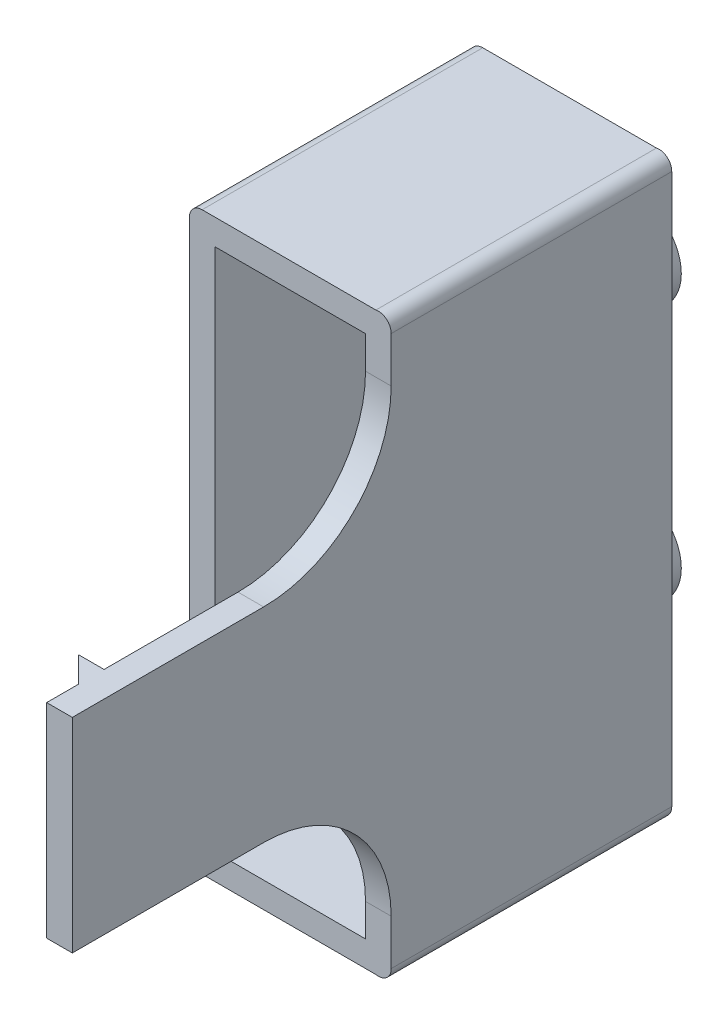
ISO-10303-21;
HEADER;
FILE_DESCRIPTION(('STEP AP214'),'2;1');
FILE_NAME('part.step','',(''),(''),'','','');
FILE_SCHEMA(('AUTOMOTIVE_DESIGN { 1 0 10303 214 1 1 1 1 }'));
ENDSEC;
DATA;
#1=APPLICATION_CONTEXT('core data for automotive mechanical design processes');
#2=APPLICATION_PROTOCOL_DEFINITION('international standard','automotive_design',2000,#1);
#3=PRODUCT_CONTEXT('',#1,'mechanical');
#4=PRODUCT('Part','Part','',(#3));
#5=PRODUCT_RELATED_PRODUCT_CATEGORY('part','',(#4));
#6=PRODUCT_DEFINITION_FORMATION('','',#4);
#7=PRODUCT_DEFINITION_CONTEXT('part definition',#1,'design');
#8=PRODUCT_DEFINITION('design','',#6,#7);
#9=PRODUCT_DEFINITION_SHAPE('','',#8);
#10=(LENGTH_UNIT() NAMED_UNIT(*) SI_UNIT(.MILLI.,.METRE.));
#11=(NAMED_UNIT(*) PLANE_ANGLE_UNIT() SI_UNIT($,.RADIAN.));
#12=(NAMED_UNIT(*) SI_UNIT($,.STERADIAN.) SOLID_ANGLE_UNIT());
#13=UNCERTAINTY_MEASURE_WITH_UNIT(LENGTH_MEASURE(1.E-05),#10,'distance_accuracy_value','');
#14=(GEOMETRIC_REPRESENTATION_CONTEXT(3) GLOBAL_UNCERTAINTY_ASSIGNED_CONTEXT((#13)) GLOBAL_UNIT_ASSIGNED_CONTEXT((#10,
#11,#12)) REPRESENTATION_CONTEXT('',''));
#15=CARTESIAN_POINT('',(0.,0.,0.));
#16=DIRECTION('',(0.,0.,1.));
#17=DIRECTION('',(1.,0.,0.));
#18=AXIS2_PLACEMENT_3D('',#15,#16,#17);
#19=CARTESIAN_POINT('',(5.9,20.55,-37.7603788570682));
#20=DIRECTION('',(1.,0.,0.));
#21=DIRECTION('',(0.,1.,0.));
#22=AXIS2_PLACEMENT_3D('',#19,#20,#21);
#23=PLANE('',#22);
#24=DIRECTION('',(0.,0.,-1.));
#25=VECTOR('',#24,1.);
#26=CARTESIAN_POINT('',(5.9,-8.00000000000002,52.));
#27=LINE('',#26,#25);
#28=CARTESIAN_POINT('',(5.9,-8.00000000000002,47.5));
#29=VERTEX_POINT('',#28);
#30=CARTESIAN_POINT('',(5.9,-8.00000000000002,37.));
#31=VERTEX_POINT('',#30);
#32=EDGE_CURVE('E56',#29,#31,#27,.T.);
#33=ORIENTED_EDGE('',*,*,#32,.F.);
#34=DIRECTION('',(0.,-1.,0.));
#35=VECTOR('',#34,1.);
#36=CARTESIAN_POINT('',(5.9,10.8284271247457,47.5));
#37=LINE('',#36,#35);
#38=CARTESIAN_POINT('',(5.9,7.99999999999998,47.5));
#39=VERTEX_POINT('',#38);
#40=EDGE_CURVE('E197',#39,#29,#37,.T.);
#41=ORIENTED_EDGE('',*,*,#40,.F.);
#42=DIRECTION('',(0.,0.,-1.));
#43=VECTOR('',#42,1.);
#44=CARTESIAN_POINT('',(5.9,7.99999999999998,52.));
#45=LINE('',#44,#43);
#46=CARTESIAN_POINT('',(5.9,7.99999999999998,37.));
#47=VERTEX_POINT('',#46);
#48=EDGE_CURVE('E231',#39,#47,#45,.T.);
#49=ORIENTED_EDGE('',*,*,#48,.T.);
#50=CARTESIAN_POINT('',(5.9,18.,37.));
#51=DIRECTION('',(1.,0.,0.));
#52=DIRECTION('',(0.,1.,0.));
#53=AXIS2_PLACEMENT_3D('',#50,#51,#52);
#54=CIRCLE('',#53,10.);
#55=CARTESIAN_POINT('',(5.9,18.,27.));
#56=VERTEX_POINT('',#55);
#57=EDGE_CURVE('E417',#47,#56,#54,.T.);
#58=ORIENTED_EDGE('',*,*,#57,.T.);
#59=DIRECTION('',(0.,1.,0.));
#60=VECTOR('',#59,1.);
#61=CARTESIAN_POINT('',(5.9,20.55,27.));
#62=LINE('',#61,#60);
#63=CARTESIAN_POINT('',(5.9,20.55,27.));
#64=VERTEX_POINT('',#63);
#65=EDGE_CURVE('E263',#56,#64,#62,.T.);
#66=ORIENTED_EDGE('',*,*,#65,.T.);
#67=DIRECTION('',(0.,0.,1.));
#68=VECTOR('',#67,1.);
#69=CARTESIAN_POINT('',(5.9,20.55,-37.7603788570682));
#70=LINE('',#69,#68);
#71=CARTESIAN_POINT('',(5.9,20.55,7.));
#72=VERTEX_POINT('',#71);
#73=EDGE_CURVE('E275',#72,#64,#70,.T.);
#74=ORIENTED_EDGE('',*,*,#73,.F.);
#75=DIRECTION('',(0.,-1.,0.));
#76=VECTOR('',#75,1.);
#77=CARTESIAN_POINT('',(5.9,20.55,7.));
#78=LINE('',#77,#76);
#79=CARTESIAN_POINT('',(5.9,-20.55,7.));
#80=VERTEX_POINT('',#79);
#81=EDGE_CURVE('E246',#72,#80,#78,.T.);
#82=ORIENTED_EDGE('',*,*,#81,.T.);
#83=DIRECTION('',(0.,0.,1.));
#84=VECTOR('',#83,1.);
#85=CARTESIAN_POINT('',(5.9,-20.55,-37.7603788570682));
#86=LINE('',#85,#84);
#87=CARTESIAN_POINT('',(5.9,-20.55,27.));
#88=VERTEX_POINT('',#87);
#89=EDGE_CURVE('E279',#80,#88,#86,.T.);
#90=ORIENTED_EDGE('',*,*,#89,.T.);
#91=CARTESIAN_POINT('',(5.9,-18.,27.));
#92=VERTEX_POINT('',#91);
#93=EDGE_CURVE('E264',#88,#92,#62,.T.);
#94=ORIENTED_EDGE('',*,*,#93,.T.);
#95=CARTESIAN_POINT('',(5.9,-18.,37.));
#96=DIRECTION('',(1.,0.,0.));
#97=DIRECTION('',(0.,1.,0.));
#98=AXIS2_PLACEMENT_3D('',#95,#96,#97);
#99=CIRCLE('',#98,10.);
#100=EDGE_CURVE('E12',#92,#31,#99,.T.);
#101=ORIENTED_EDGE('',*,*,#100,.T.);
#102=EDGE_LOOP('',(#33,#41,#49,#58,#66,#74,#82,#90,#94,#101));
#103=FACE_BOUND('',#102,.T.);
#104=ADVANCED_FACE('F41',(#103),#23,.F.);
#105=CARTESIAN_POINT('',(0.,-9.99916171678664,5.));
#106=DIRECTION('',(0.,0.,-1.));
#107=DIRECTION('',(-1.,0.,0.));
#108=AXIS2_PLACEMENT_3D('',#105,#106,#107);
#109=CYLINDRICAL_SURFACE('',#108,1.65);
#110=CARTESIAN_POINT('',(0.,-9.99916171678664,0.));
#111=DIRECTION('',(0.,0.,1.));
#112=DIRECTION('',(1.,0.,0.));
#113=AXIS2_PLACEMENT_3D('',#110,#111,#112);
#114=CIRCLE('',#113,1.65);
#115=CARTESIAN_POINT('',(1.65,-9.99916171678664,0.));
#116=VERTEX_POINT('',#115);
#117=EDGE_CURVE('E384',#116,#116,#114,.T.);
#118=ORIENTED_EDGE('',*,*,#117,.F.);
#119=EDGE_LOOP('',(#118));
#120=FACE_BOUND('',#119,.T.);
#121=CARTESIAN_POINT('',(0.,-9.99916171678664,7.));
#122=DIRECTION('',(0.,0.,1.));
#123=DIRECTION('',(1.,0.,0.));
#124=AXIS2_PLACEMENT_3D('',#121,#122,#123);
#125=CIRCLE('',#124,1.65);
#126=CARTESIAN_POINT('',(1.65,-9.99916171678664,7.));
#127=VERTEX_POINT('',#126);
#128=EDGE_CURVE('E288',#127,#127,#125,.T.);
#129=ORIENTED_EDGE('',*,*,#128,.T.);
#130=EDGE_LOOP('',(#129));
#131=FACE_BOUND('',#130,.T.);
#132=ADVANCED_FACE('F532',(#120,#131),#109,.F.);
#133=CARTESIAN_POINT('',(0.,9.99916171678664,27.));
#134=DIRECTION('',(0.,0.,-1.));
#135=DIRECTION('',(-1.,0.,0.));
#136=AXIS2_PLACEMENT_3D('',#133,#134,#135);
#137=CYLINDRICAL_SURFACE('',#136,1.65);
#138=CARTESIAN_POINT('',(0.,9.99916171678664,0.));
#139=DIRECTION('',(0.,0.,1.));
#140=DIRECTION('',(1.,0.,0.));
#141=AXIS2_PLACEMENT_3D('',#138,#139,#140);
#142=CIRCLE('',#141,1.65);
#143=CARTESIAN_POINT('',(1.65,9.99916171678664,0.));
#144=VERTEX_POINT('',#143);
#145=EDGE_CURVE('E292',#144,#144,#142,.T.);
#146=ORIENTED_EDGE('',*,*,#145,.F.);
#147=EDGE_LOOP('',(#146));
#148=FACE_BOUND('',#147,.T.);
#149=CARTESIAN_POINT('',(0.,9.99916171678664,7.));
#150=DIRECTION('',(0.,0.,1.));
#151=DIRECTION('',(1.,0.,0.));
#152=AXIS2_PLACEMENT_3D('',#149,#150,#151);
#153=CIRCLE('',#152,1.65);
#154=CARTESIAN_POINT('',(1.65,9.99916171678664,7.));
#155=VERTEX_POINT('',#154);
#156=EDGE_CURVE('E287',#155,#155,#153,.T.);
#157=ORIENTED_EDGE('',*,*,#156,.T.);
#158=EDGE_LOOP('',(#157));
#159=FACE_BOUND('',#158,.T.);
#160=ADVANCED_FACE('F512',(#148,#159),#137,.F.);
#161=CARTESIAN_POINT('',(6.91020488187485,-21.5802459465389,5.));
#162=DIRECTION('',(0.,0.,1.));
#163=DIRECTION('',(1.,0.,0.));
#164=AXIS2_PLACEMENT_3D('',#161,#162,#163);
#165=PLANE('',#164);
#166=CARTESIAN_POINT('',(6.91020488187485,-21.5802459465389,5.));
#167=DIRECTION('',(0.,0.,1.));
#168=DIRECTION('',(1.,0.,0.));
#169=AXIS2_PLACEMENT_3D('',#166,#167,#168);
#170=CIRCLE('',#169,1.);
#171=CARTESIAN_POINT('',(6.71,-22.56,5.));
#172=VERTEX_POINT('',#171);
#173=CARTESIAN_POINT('',(7.91,-21.5600043612965,5.));
#174=VERTEX_POINT('',#173);
#175=EDGE_CURVE('E300',#172,#174,#170,.T.);
#176=ORIENTED_EDGE('',*,*,#175,.F.);
#177=DIRECTION('',(1.,0.,0.));
#178=VECTOR('',#177,1.);
#179=CARTESIAN_POINT('',(-6.91000000000002,-22.56,5.));
#180=LINE('',#179,#178);
#181=CARTESIAN_POINT('',(-6.91000000000002,-22.56,5.));
#182=VERTEX_POINT('',#181);
#183=EDGE_CURVE('E306',#182,#172,#180,.T.);
#184=ORIENTED_EDGE('',*,*,#183,.F.);
#185=CARTESIAN_POINT('',(-6.91000000000002,-21.56,5.));
#186=DIRECTION('',(0.,0.,1.));
#187=DIRECTION('',(1.,0.,0.));
#188=AXIS2_PLACEMENT_3D('',#185,#186,#187);
#189=CIRCLE('',#188,0.999999999999995);
#190=CARTESIAN_POINT('',(-7.91000000000001,-21.56,5.));
#191=VERTEX_POINT('',#190);
#192=EDGE_CURVE('E348',#191,#182,#189,.T.);
#193=ORIENTED_EDGE('',*,*,#192,.F.);
#194=DIRECTION('',(0.,-1.,0.));
#195=VECTOR('',#194,1.);
#196=CARTESIAN_POINT('',(-7.91000000000001,21.56,5.));
#197=LINE('',#196,#195);
#198=CARTESIAN_POINT('',(-7.91000000000001,21.56,5.));
#199=VERTEX_POINT('',#198);
#200=EDGE_CURVE('E345',#199,#191,#197,.T.);
#201=ORIENTED_EDGE('',*,*,#200,.F.);
#202=CARTESIAN_POINT('',(-6.91000000000002,21.56,5.));
#203=DIRECTION('',(0.,0.,1.));
#204=DIRECTION('',(1.,0.,0.));
#205=AXIS2_PLACEMENT_3D('',#202,#203,#204);
#206=CIRCLE('',#205,1.);
#207=CARTESIAN_POINT('',(-6.91000000000002,22.56,5.));
#208=VERTEX_POINT('',#207);
#209=EDGE_CURVE('E342',#208,#199,#206,.T.);
#210=ORIENTED_EDGE('',*,*,#209,.F.);
#211=DIRECTION('',(-1.,0.,0.));
#212=VECTOR('',#211,1.);
#213=CARTESIAN_POINT('',(-6.91000000000002,22.56,5.));
#214=LINE('',#213,#212);
#215=CARTESIAN_POINT('',(6.70999999999999,22.56,5.));
#216=VERTEX_POINT('',#215);
#217=EDGE_CURVE('E339',#216,#208,#214,.T.);
#218=ORIENTED_EDGE('',*,*,#217,.F.);
#219=CARTESIAN_POINT('',(6.91020488187485,21.5802459465389,5.));
#220=DIRECTION('',(0.,0.,1.));
#221=DIRECTION('',(-1.,0.,0.));
#222=AXIS2_PLACEMENT_3D('',#219,#220,#221);
#223=CIRCLE('',#222,1.);
#224=CARTESIAN_POINT('',(7.91,21.5600043612965,5.));
#225=VERTEX_POINT('',#224);
#226=EDGE_CURVE('E336',#225,#216,#223,.T.);
#227=ORIENTED_EDGE('',*,*,#226,.F.);
#228=DIRECTION('',(0.,1.,0.));
#229=VECTOR('',#228,1.);
#230=CARTESIAN_POINT('',(7.91,21.5600043612965,5.));
#231=LINE('',#230,#229);
#232=EDGE_CURVE('E333',#174,#225,#231,.T.);
#233=ORIENTED_EDGE('',*,*,#232,.F.);
#234=EDGE_LOOP('',(#176,#184,#193,#201,#210,#218,#227,#233));
#235=FACE_BOUND('',#234,.T.);
#236=CARTESIAN_POINT('',(0.,-9.99916171678664,5.));
#237=DIRECTION('',(0.,0.,1.));
#238=DIRECTION('',(1.,0.,0.));
#239=AXIS2_PLACEMENT_3D('',#236,#237,#238);
#240=CIRCLE('',#239,3.66);
#241=CARTESIAN_POINT('',(3.66,-9.99916171678664,5.));
#242=VERTEX_POINT('',#241);
#243=EDGE_CURVE('E389',#242,#242,#240,.T.);
#244=ORIENTED_EDGE('',*,*,#243,.T.);
#245=EDGE_LOOP('',(#244));
#246=FACE_BOUND('',#245,.T.);
#247=CARTESIAN_POINT('',(0.,9.99916171678664,5.));
#248=DIRECTION('',(0.,0.,1.));
#249=DIRECTION('',(1.,0.,0.));
#250=AXIS2_PLACEMENT_3D('',#247,#248,#249);
#251=CIRCLE('',#250,3.66);
#252=CARTESIAN_POINT('',(3.66,9.99916171678664,5.));
#253=VERTEX_POINT('',#252);
#254=EDGE_CURVE('E393',#253,#253,#251,.F.);
#255=ORIENTED_EDGE('',*,*,#254,.F.);
#256=EDGE_LOOP('',(#255));
#257=FACE_BOUND('',#256,.T.);
#258=ADVANCED_FACE('F508',(#235,#246,#257),#165,.F.);
#259=CARTESIAN_POINT('',(0.,-9.99916171678664,0.));
#260=DIRECTION('',(0.,0.,1.));
#261=DIRECTION('',(1.,0.,0.));
#262=AXIS2_PLACEMENT_3D('',#259,#260,#261);
#263=PLANE('',#262);
#264=CARTESIAN_POINT('',(0.,-9.99916171678664,0.));
#265=DIRECTION('',(0.,0.,1.));
#266=DIRECTION('',(1.,0.,0.));
#267=AXIS2_PLACEMENT_3D('',#264,#265,#266);
#268=CIRCLE('',#267,3.66);
#269=CARTESIAN_POINT('',(3.66,-9.99916171678664,0.));
#270=VERTEX_POINT('',#269);
#271=EDGE_CURVE('E388',#270,#270,#268,.T.);
#272=ORIENTED_EDGE('',*,*,#271,.F.);
#273=EDGE_LOOP('',(#272));
#274=FACE_BOUND('',#273,.T.);
#275=ORIENTED_EDGE('',*,*,#117,.T.);
#276=EDGE_LOOP('',(#275));
#277=FACE_BOUND('',#276,.T.);
#278=ADVANCED_FACE('F511',(#274,#277),#263,.F.);
#279=CARTESIAN_POINT('',(0.,-9.99916171678664,5.));
#280=DIRECTION('',(0.,0.,-1.));
#281=DIRECTION('',(-1.,0.,0.));
#282=AXIS2_PLACEMENT_3D('',#279,#280,#281);
#283=CYLINDRICAL_SURFACE('',#282,3.66);
#284=ORIENTED_EDGE('',*,*,#243,.F.);
#285=EDGE_LOOP('',(#284));
#286=FACE_BOUND('',#285,.T.);
#287=ORIENTED_EDGE('',*,*,#271,.T.);
#288=EDGE_LOOP('',(#287));
#289=FACE_BOUND('',#288,.T.);
#290=ADVANCED_FACE('F570',(#286,#289),#283,.T.);
#291=CARTESIAN_POINT('',(6.91020488187485,-21.5802459465389,27.));
#292=DIRECTION('',(0.,0.,1.));
#293=DIRECTION('',(1.,0.,0.));
#294=AXIS2_PLACEMENT_3D('',#291,#292,#293);
#295=PLANE('',#294);
#296=ORIENTED_EDGE('',*,*,#65,.F.);
#297=DIRECTION('',(-1.,0.,0.));
#298=VECTOR('',#297,1.);
#299=CARTESIAN_POINT('',(6.91020488187485,18.,27.));
#300=LINE('',#299,#298);
#301=CARTESIAN_POINT('',(7.91,18.,27.));
#302=VERTEX_POINT('',#301);
#303=EDGE_CURVE('E410',#56,#302,#300,.F.);
#304=ORIENTED_EDGE('',*,*,#303,.T.);
#305=DIRECTION('',(0.,1.,0.));
#306=VECTOR('',#305,1.);
#307=CARTESIAN_POINT('',(7.91,21.5600043612965,27.));
#308=LINE('',#307,#306);
#309=CARTESIAN_POINT('',(7.91,21.5600043612965,27.));
#310=VERTEX_POINT('',#309);
#311=EDGE_CURVE('E305',#302,#310,#308,.T.);
#312=ORIENTED_EDGE('',*,*,#311,.T.);
#313=CARTESIAN_POINT('',(6.91020488187485,21.5802459465389,27.));
#314=DIRECTION('',(0.,0.,1.));
#315=DIRECTION('',(-1.,0.,0.));
#316=AXIS2_PLACEMENT_3D('',#313,#314,#315);
#317=CIRCLE('',#316,1.);
#318=CARTESIAN_POINT('',(6.70999999999999,22.56,27.));
#319=VERTEX_POINT('',#318);
#320=EDGE_CURVE('E311',#310,#319,#317,.T.);
#321=ORIENTED_EDGE('',*,*,#320,.T.);
#322=DIRECTION('',(-1.,0.,0.));
#323=VECTOR('',#322,1.);
#324=CARTESIAN_POINT('',(-6.91000000000002,22.56,27.));
#325=LINE('',#324,#323);
#326=CARTESIAN_POINT('',(-6.91000000000002,22.56,27.));
#327=VERTEX_POINT('',#326);
#328=EDGE_CURVE('E314',#319,#327,#325,.T.);
#329=ORIENTED_EDGE('',*,*,#328,.T.);
#330=CARTESIAN_POINT('',(-6.91000000000002,21.56,27.));
#331=DIRECTION('',(0.,0.,1.));
#332=DIRECTION('',(1.,0.,0.));
#333=AXIS2_PLACEMENT_3D('',#330,#331,#332);
#334=CIRCLE('',#333,1.);
#335=CARTESIAN_POINT('',(-7.91000000000001,21.56,27.));
#336=VERTEX_POINT('',#335);
#337=EDGE_CURVE('E317',#327,#336,#334,.T.);
#338=ORIENTED_EDGE('',*,*,#337,.T.);
#339=DIRECTION('',(0.,-1.,0.));
#340=VECTOR('',#339,1.);
#341=CARTESIAN_POINT('',(-7.91000000000001,21.56,27.));
#342=LINE('',#341,#340);
#343=CARTESIAN_POINT('',(-7.91000000000001,-21.56,27.));
#344=VERTEX_POINT('',#343);
#345=EDGE_CURVE('E320',#336,#344,#342,.T.);
#346=ORIENTED_EDGE('',*,*,#345,.T.);
#347=CARTESIAN_POINT('',(-6.91000000000002,-21.56,27.));
#348=DIRECTION('',(0.,0.,1.));
#349=DIRECTION('',(1.,0.,0.));
#350=AXIS2_PLACEMENT_3D('',#347,#348,#349);
#351=CIRCLE('',#350,0.999999999999995);
#352=CARTESIAN_POINT('',(-6.91000000000002,-22.56,27.));
#353=VERTEX_POINT('',#352);
#354=EDGE_CURVE('E323',#344,#353,#351,.T.);
#355=ORIENTED_EDGE('',*,*,#354,.T.);
#356=DIRECTION('',(1.,0.,0.));
#357=VECTOR('',#356,1.);
#358=CARTESIAN_POINT('',(-6.91000000000002,-22.56,27.));
#359=LINE('',#358,#357);
#360=CARTESIAN_POINT('',(6.71,-22.56,27.));
#361=VERTEX_POINT('',#360);
#362=EDGE_CURVE('E326',#353,#361,#359,.T.);
#363=ORIENTED_EDGE('',*,*,#362,.T.);
#364=CARTESIAN_POINT('',(6.91020488187485,-21.5802459465389,27.));
#365=DIRECTION('',(0.,0.,1.));
#366=DIRECTION('',(1.,0.,0.));
#367=AXIS2_PLACEMENT_3D('',#364,#365,#366);
#368=CIRCLE('',#367,1.);
#369=CARTESIAN_POINT('',(7.91,-21.5600043612965,27.));
#370=VERTEX_POINT('',#369);
#371=EDGE_CURVE('E301',#361,#370,#368,.T.);
#372=ORIENTED_EDGE('',*,*,#371,.T.);
#373=CARTESIAN_POINT('',(7.91,-18.,27.));
#374=VERTEX_POINT('',#373);
#375=EDGE_CURVE('E307',#370,#374,#308,.T.);
#376=ORIENTED_EDGE('',*,*,#375,.T.);
#377=DIRECTION('',(1.,0.,0.));
#378=VECTOR('',#377,1.);
#379=CARTESIAN_POINT('',(6.91020488187485,-18.,27.));
#380=LINE('',#379,#378);
#381=EDGE_CURVE('E407',#374,#92,#380,.F.);
#382=ORIENTED_EDGE('',*,*,#381,.T.);
#383=ORIENTED_EDGE('',*,*,#93,.F.);
#384=DIRECTION('',(1.,0.,0.));
#385=VECTOR('',#384,1.);
#386=CARTESIAN_POINT('',(-5.90000000000001,-20.55,27.));
#387=LINE('',#386,#385);
#388=CARTESIAN_POINT('',(-5.90000000000001,-20.55,27.));
#389=VERTEX_POINT('',#388);
#390=EDGE_CURVE('E259',#389,#88,#387,.T.);
#391=ORIENTED_EDGE('',*,*,#390,.F.);
#392=DIRECTION('',(0.,-1.,0.));
#393=VECTOR('',#392,1.);
#394=CARTESIAN_POINT('',(-5.90000000000001,20.55,27.));
#395=LINE('',#394,#393);
#396=CARTESIAN_POINT('',(-5.90000000000001,20.55,27.));
#397=VERTEX_POINT('',#396);
#398=EDGE_CURVE('E245',#397,#389,#395,.T.);
#399=ORIENTED_EDGE('',*,*,#398,.F.);
#400=DIRECTION('',(-1.,0.,0.));
#401=VECTOR('',#400,1.);
#402=CARTESIAN_POINT('',(-5.90000000000001,20.55,27.));
#403=LINE('',#402,#401);
#404=EDGE_CURVE('E268',#64,#397,#403,.T.);
#405=ORIENTED_EDGE('',*,*,#404,.F.);
#406=EDGE_LOOP('',(#296,#304,#312,#321,#329,#338,#346,#355,#363,#372,#376,#382,#383,#391,#399,#405));
#407=FACE_BOUND('',#406,.T.);
#408=ADVANCED_FACE('F432',(#407),#295,.T.);
#409=CARTESIAN_POINT('',(6.91020488187485,-21.5802459465389,27.));
#410=DIRECTION('',(0.,0.,-1.));
#411=DIRECTION('',(-1.,0.,0.));
#412=AXIS2_PLACEMENT_3D('',#409,#410,#411);
#413=CYLINDRICAL_SURFACE('',#412,1.);
#414=ORIENTED_EDGE('',*,*,#175,.T.);
#415=DIRECTION('',(0.,0.,-1.));
#416=VECTOR('',#415,1.);
#417=CARTESIAN_POINT('',(7.91,-21.5600043612965,27.));
#418=LINE('',#417,#416);
#419=EDGE_CURVE('E380',#370,#174,#418,.T.);
#420=ORIENTED_EDGE('',*,*,#419,.F.);
#421=ORIENTED_EDGE('',*,*,#371,.F.);
#422=DIRECTION('',(0.,0.,-1.));
#423=VECTOR('',#422,1.);
#424=CARTESIAN_POINT('',(6.71,-22.56,27.));
#425=LINE('',#424,#423);
#426=EDGE_CURVE('E329',#361,#172,#425,.T.);
#427=ORIENTED_EDGE('',*,*,#426,.T.);
#428=EDGE_LOOP('',(#414,#420,#421,#427));
#429=FACE_BOUND('',#428,.T.);
#430=ADVANCED_FACE('F506',(#429),#413,.T.);
#431=CARTESIAN_POINT('',(7.91,21.5600043612965,27.));
#432=DIRECTION('',(-1.,0.,0.));
#433=DIRECTION('',(0.,0.,1.));
#434=AXIS2_PLACEMENT_3D('',#431,#432,#433);
#435=PLANE('',#434);
#436=ORIENTED_EDGE('',*,*,#232,.T.);
#437=DIRECTION('',(0.,0.,-1.));
#438=VECTOR('',#437,1.);
#439=CARTESIAN_POINT('',(7.91,21.5600043612965,27.));
#440=LINE('',#439,#438);
#441=EDGE_CURVE('E376',#310,#225,#440,.T.);
#442=ORIENTED_EDGE('',*,*,#441,.F.);
#443=ORIENTED_EDGE('',*,*,#311,.F.);
#444=CARTESIAN_POINT('',(7.91,18.,37.));
#445=DIRECTION('',(-1.,0.,0.));
#446=DIRECTION('',(0.,0.,1.));
#447=AXIS2_PLACEMENT_3D('',#444,#445,#446);
#448=CIRCLE('',#447,10.);
#449=CARTESIAN_POINT('',(7.91000000000012,7.99999999999998,37.));
#450=VERTEX_POINT('',#449);
#451=EDGE_CURVE('E420',#302,#450,#448,.T.);
#452=ORIENTED_EDGE('',*,*,#451,.T.);
#453=DIRECTION('',(0.,0.,-1.));
#454=VECTOR('',#453,1.);
#455=CARTESIAN_POINT('',(7.91000000000012,7.99999999999998,52.));
#456=LINE('',#455,#454);
#457=CARTESIAN_POINT('',(7.91000000000012,7.99999999999998,52.));
#458=VERTEX_POINT('',#457);
#459=EDGE_CURVE('E235',#458,#450,#456,.T.);
#460=ORIENTED_EDGE('',*,*,#459,.F.);
#461=DIRECTION('',(0.,1.,0.));
#462=VECTOR('',#461,1.);
#463=CARTESIAN_POINT('',(7.91000000000012,7.99999999999998,52.));
#464=LINE('',#463,#462);
#465=CARTESIAN_POINT('',(7.91000000000012,-8.00000000000002,52.));
#466=VERTEX_POINT('',#465);
#467=EDGE_CURVE('E225',#466,#458,#464,.T.);
#468=ORIENTED_EDGE('',*,*,#467,.F.);
#469=DIRECTION('',(0.,0.,-1.));
#470=VECTOR('',#469,1.);
#471=CARTESIAN_POINT('',(7.91000000000012,-8.00000000000002,52.));
#472=LINE('',#471,#470);
#473=CARTESIAN_POINT('',(7.91000000000012,-8.00000000000002,37.));
#474=VERTEX_POINT('',#473);
#475=EDGE_CURVE('E239',#466,#474,#472,.T.);
#476=ORIENTED_EDGE('',*,*,#475,.T.);
#477=CARTESIAN_POINT('',(7.91,-18.,37.));
#478=DIRECTION('',(-1.,0.,0.));
#479=DIRECTION('',(0.,0.,1.));
#480=AXIS2_PLACEMENT_3D('',#477,#478,#479);
#481=CIRCLE('',#480,10.);
#482=EDGE_CURVE('E50',#474,#374,#481,.T.);
#483=ORIENTED_EDGE('',*,*,#482,.T.);
#484=ORIENTED_EDGE('',*,*,#375,.F.);
#485=ORIENTED_EDGE('',*,*,#419,.T.);
#486=EDGE_LOOP('',(#436,#442,#443,#452,#460,#468,#476,#483,#484,#485));
#487=FACE_BOUND('',#486,.T.);
#488=ADVANCED_FACE('F424',(#487),#435,.F.);
#489=CARTESIAN_POINT('',(6.91020488187485,21.5802459465389,27.));
#490=DIRECTION('',(0.,0.,-1.));
#491=DIRECTION('',(-1.,0.,0.));
#492=AXIS2_PLACEMENT_3D('',#489,#490,#491);
#493=CYLINDRICAL_SURFACE('',#492,1.);
#494=ORIENTED_EDGE('',*,*,#226,.T.);
#495=DIRECTION('',(0.,0.,-1.));
#496=VECTOR('',#495,1.);
#497=CARTESIAN_POINT('',(6.70999999999999,22.56,27.));
#498=LINE('',#497,#496);
#499=EDGE_CURVE('E372',#319,#216,#498,.T.);
#500=ORIENTED_EDGE('',*,*,#499,.F.);
#501=ORIENTED_EDGE('',*,*,#320,.F.);
#502=ORIENTED_EDGE('',*,*,#441,.T.);
#503=EDGE_LOOP('',(#494,#500,#501,#502));
#504=FACE_BOUND('',#503,.T.);
#505=ADVANCED_FACE('F478',(#504),#493,.T.);
#506=CARTESIAN_POINT('',(-6.91000000000002,22.56,27.));
#507=DIRECTION('',(0.,-1.,0.));
#508=DIRECTION('',(0.,0.,-1.));
#509=AXIS2_PLACEMENT_3D('',#506,#507,#508);
#510=PLANE('',#509);
#511=ORIENTED_EDGE('',*,*,#217,.T.);
#512=DIRECTION('',(0.,0.,-1.));
#513=VECTOR('',#512,1.);
#514=CARTESIAN_POINT('',(-6.91000000000002,22.56,27.));
#515=LINE('',#514,#513);
#516=EDGE_CURVE('E368',#327,#208,#515,.T.);
#517=ORIENTED_EDGE('',*,*,#516,.F.);
#518=ORIENTED_EDGE('',*,*,#328,.F.);
#519=ORIENTED_EDGE('',*,*,#499,.T.);
#520=EDGE_LOOP('',(#511,#517,#518,#519));
#521=FACE_BOUND('',#520,.T.);
#522=ADVANCED_FACE('F483',(#521),#510,.F.);
#523=CARTESIAN_POINT('',(-6.91000000000002,21.56,27.));
#524=DIRECTION('',(0.,0.,-1.));
#525=DIRECTION('',(-1.,0.,0.));
#526=AXIS2_PLACEMENT_3D('',#523,#524,#525);
#527=CYLINDRICAL_SURFACE('',#526,1.);
#528=ORIENTED_EDGE('',*,*,#209,.T.);
#529=DIRECTION('',(0.,0.,-1.));
#530=VECTOR('',#529,1.);
#531=CARTESIAN_POINT('',(-7.91000000000001,21.56,27.));
#532=LINE('',#531,#530);
#533=EDGE_CURVE('E364',#336,#199,#532,.T.);
#534=ORIENTED_EDGE('',*,*,#533,.F.);
#535=ORIENTED_EDGE('',*,*,#337,.F.);
#536=ORIENTED_EDGE('',*,*,#516,.T.);
#537=EDGE_LOOP('',(#528,#534,#535,#536));
#538=FACE_BOUND('',#537,.T.);
#539=ADVANCED_FACE('F489',(#538),#527,.T.);
#540=CARTESIAN_POINT('',(-7.91000000000001,21.56,27.));
#541=DIRECTION('',(1.,0.,0.));
#542=DIRECTION('',(0.,0.,-1.));
#543=AXIS2_PLACEMENT_3D('',#540,#541,#542);
#544=PLANE('',#543);
#545=ORIENTED_EDGE('',*,*,#200,.T.);
#546=DIRECTION('',(0.,0.,-1.));
#547=VECTOR('',#546,1.);
#548=CARTESIAN_POINT('',(-7.91000000000001,-21.56,27.));
#549=LINE('',#548,#547);
#550=EDGE_CURVE('E360',#344,#191,#549,.T.);
#551=ORIENTED_EDGE('',*,*,#550,.F.);
#552=ORIENTED_EDGE('',*,*,#345,.F.);
#553=ORIENTED_EDGE('',*,*,#533,.T.);
#554=EDGE_LOOP('',(#545,#551,#552,#553));
#555=FACE_BOUND('',#554,.T.);
#556=ADVANCED_FACE('F493',(#555),#544,.F.);
#557=CARTESIAN_POINT('',(-6.91000000000002,-21.56,27.));
#558=DIRECTION('',(0.,0.,-1.));
#559=DIRECTION('',(-1.,0.,0.));
#560=AXIS2_PLACEMENT_3D('',#557,#558,#559);
#561=CYLINDRICAL_SURFACE('',#560,0.999999999999995);
#562=ORIENTED_EDGE('',*,*,#192,.T.);
#563=DIRECTION('',(0.,0.,-1.));
#564=VECTOR('',#563,1.);
#565=CARTESIAN_POINT('',(-6.91000000000002,-22.56,27.));
#566=LINE('',#565,#564);
#567=EDGE_CURVE('E356',#353,#182,#566,.T.);
#568=ORIENTED_EDGE('',*,*,#567,.F.);
#569=ORIENTED_EDGE('',*,*,#354,.F.);
#570=ORIENTED_EDGE('',*,*,#550,.T.);
#571=EDGE_LOOP('',(#562,#568,#569,#570));
#572=FACE_BOUND('',#571,.T.);
#573=ADVANCED_FACE('F498',(#572),#561,.T.);
#574=CARTESIAN_POINT('',(-6.91000000000002,-22.56,27.));
#575=DIRECTION('',(0.,1.,0.));
#576=DIRECTION('',(0.,0.,1.));
#577=AXIS2_PLACEMENT_3D('',#574,#575,#576);
#578=PLANE('',#577);
#579=ORIENTED_EDGE('',*,*,#183,.T.);
#580=ORIENTED_EDGE('',*,*,#426,.F.);
#581=ORIENTED_EDGE('',*,*,#362,.F.);
#582=ORIENTED_EDGE('',*,*,#567,.T.);
#583=EDGE_LOOP('',(#579,#580,#581,#582));
#584=FACE_BOUND('',#583,.T.);
#585=ADVANCED_FACE('F502',(#584),#578,.F.);
#586=CARTESIAN_POINT('',(0.,9.99916171678664,0.));
#587=DIRECTION('',(0.,0.,1.));
#588=DIRECTION('',(1.,0.,0.));
#589=AXIS2_PLACEMENT_3D('',#586,#587,#588);
#590=PLANE('',#589);
#591=CARTESIAN_POINT('',(0.,9.99916171678664,0.));
#592=DIRECTION('',(0.,0.,1.));
#593=DIRECTION('',(1.,0.,0.));
#594=AXIS2_PLACEMENT_3D('',#591,#592,#593);
#595=CIRCLE('',#594,3.66);
#596=CARTESIAN_POINT('',(3.66,9.99916171678664,0.));
#597=VERTEX_POINT('',#596);
#598=EDGE_CURVE('E296',#597,#597,#595,.T.);
#599=ORIENTED_EDGE('',*,*,#598,.F.);
#600=EDGE_LOOP('',(#599));
#601=FACE_BOUND('',#600,.T.);
#602=ORIENTED_EDGE('',*,*,#145,.T.);
#603=EDGE_LOOP('',(#602));
#604=FACE_BOUND('',#603,.T.);
#605=ADVANCED_FACE('F521',(#601,#604),#590,.F.);
#606=CARTESIAN_POINT('',(0.,9.99916171678664,5.));
#607=DIRECTION('',(0.,0.,-1.));
#608=DIRECTION('',(-1.,0.,0.));
#609=AXIS2_PLACEMENT_3D('',#606,#607,#608);
#610=CYLINDRICAL_SURFACE('',#609,3.66);
#611=ORIENTED_EDGE('',*,*,#254,.T.);
#612=EDGE_LOOP('',(#611));
#613=FACE_BOUND('',#612,.T.);
#614=ORIENTED_EDGE('',*,*,#598,.T.);
#615=EDGE_LOOP('',(#614));
#616=FACE_BOUND('',#615,.T.);
#617=ADVANCED_FACE('F518',(#613,#616),#610,.T.);
#618=CARTESIAN_POINT('',(-5.90000000000001,20.55,-37.7603788570682));
#619=DIRECTION('',(-1.,0.,0.));
#620=DIRECTION('',(0.,-1.,0.));
#621=AXIS2_PLACEMENT_3D('',#618,#619,#620);
#622=PLANE('',#621);
#623=DIRECTION('',(0.,1.,0.));
#624=VECTOR('',#623,1.);
#625=CARTESIAN_POINT('',(-5.90000000000001,20.55,7.));
#626=LINE('',#625,#624);
#627=CARTESIAN_POINT('',(-5.90000000000001,-20.55,7.));
#628=VERTEX_POINT('',#627);
#629=CARTESIAN_POINT('',(-5.90000000000001,20.55,7.));
#630=VERTEX_POINT('',#629);
#631=EDGE_CURVE('E253',#628,#630,#626,.T.);
#632=ORIENTED_EDGE('',*,*,#631,.T.);
#633=DIRECTION('',(0.,0.,1.));
#634=VECTOR('',#633,1.);
#635=CARTESIAN_POINT('',(-5.90000000000001,20.55,-37.7603788570682));
#636=LINE('',#635,#634);
#637=EDGE_CURVE('E250',#630,#397,#636,.T.);
#638=ORIENTED_EDGE('',*,*,#637,.T.);
#639=ORIENTED_EDGE('',*,*,#398,.T.);
#640=DIRECTION('',(0.,0.,1.));
#641=VECTOR('',#640,1.);
#642=CARTESIAN_POINT('',(-5.90000000000001,-20.55,-37.7603788570682));
#643=LINE('',#642,#641);
#644=EDGE_CURVE('E272',#628,#389,#643,.T.);
#645=ORIENTED_EDGE('',*,*,#644,.F.);
#646=EDGE_LOOP('',(#632,#638,#639,#645));
#647=FACE_BOUND('',#646,.T.);
#648=ADVANCED_FACE('F447',(#647),#622,.F.);
#649=CARTESIAN_POINT('',(-5.90000000000001,20.55,-37.7603788570682));
#650=DIRECTION('',(0.,1.,0.));
#651=DIRECTION('',(0.,0.,1.));
#652=AXIS2_PLACEMENT_3D('',#649,#650,#651);
#653=PLANE('',#652);
#654=DIRECTION('',(1.,0.,0.));
#655=VECTOR('',#654,1.);
#656=CARTESIAN_POINT('',(-5.90000000000001,20.55,7.));
#657=LINE('',#656,#655);
#658=EDGE_CURVE('E249',#630,#72,#657,.T.);
#659=ORIENTED_EDGE('',*,*,#658,.T.);
#660=ORIENTED_EDGE('',*,*,#73,.T.);
#661=ORIENTED_EDGE('',*,*,#404,.T.);
#662=ORIENTED_EDGE('',*,*,#637,.F.);
#663=EDGE_LOOP('',(#659,#660,#661,#662));
#664=FACE_BOUND('',#663,.T.);
#665=ADVANCED_FACE('F451',(#664),#653,.F.);
#666=CARTESIAN_POINT('',(5.9,7.99999999999998,52.));
#667=VERTEX_POINT('',#666);
#668=CARTESIAN_POINT('',(5.9,7.99999999999998,49.4999999999997));
#669=VERTEX_POINT('',#668);
#670=EDGE_CURVE('E232',#667,#669,#45,.T.);
#671=ORIENTED_EDGE('',*,*,#670,.T.);
#672=DIRECTION('',(0.,-1.,0.));
#673=VECTOR('',#672,1.);
#674=CARTESIAN_POINT('',(5.9,10.8284271247457,49.4999999999997));
#675=LINE('',#674,#673);
#676=CARTESIAN_POINT('',(5.9,-8.00000000000002,49.4999999999997));
#677=VERTEX_POINT('',#676);
#678=EDGE_CURVE('E64',#669,#677,#675,.T.);
#679=ORIENTED_EDGE('',*,*,#678,.T.);
#680=CARTESIAN_POINT('',(5.9,-8.00000000000002,52.));
#681=VERTEX_POINT('',#680);
#682=EDGE_CURVE('E203',#681,#677,#27,.T.);
#683=ORIENTED_EDGE('',*,*,#682,.F.);
#684=DIRECTION('',(0.,-1.,0.));
#685=VECTOR('',#684,1.);
#686=CARTESIAN_POINT('',(5.9,7.99999999999998,52.));
#687=LINE('',#686,#685);
#688=EDGE_CURVE('E218',#667,#681,#687,.T.);
#689=ORIENTED_EDGE('',*,*,#688,.F.);
#690=EDGE_LOOP('',(#671,#679,#683,#689));
#691=FACE_BOUND('',#690,.T.);
#692=ADVANCED_FACE('F547',(#691),#23,.F.);
#693=CARTESIAN_POINT('',(-5.90000000000001,-20.55,-37.7603788570682));
#694=DIRECTION('',(0.,-1.,0.));
#695=DIRECTION('',(0.,0.,-1.));
#696=AXIS2_PLACEMENT_3D('',#693,#694,#695);
#697=PLANE('',#696);
#698=DIRECTION('',(-1.,0.,0.));
#699=VECTOR('',#698,1.);
#700=CARTESIAN_POINT('',(-5.90000000000001,-20.55,7.));
#701=LINE('',#700,#699);
#702=EDGE_CURVE('E256',#80,#628,#701,.T.);
#703=ORIENTED_EDGE('',*,*,#702,.T.);
#704=ORIENTED_EDGE('',*,*,#644,.T.);
#705=ORIENTED_EDGE('',*,*,#390,.T.);
#706=ORIENTED_EDGE('',*,*,#89,.F.);
#707=EDGE_LOOP('',(#703,#704,#705,#706));
#708=FACE_BOUND('',#707,.T.);
#709=ADVANCED_FACE('F442',(#708),#697,.F.);
#710=CARTESIAN_POINT('',(6.91020488187485,-21.5802459465389,7.));
#711=DIRECTION('',(0.,0.,1.));
#712=DIRECTION('',(1.,0.,0.));
#713=AXIS2_PLACEMENT_3D('',#710,#711,#712);
#714=PLANE('',#713);
#715=ORIENTED_EDGE('',*,*,#128,.F.);
#716=EDGE_LOOP('',(#715));
#717=FACE_BOUND('',#716,.T.);
#718=ORIENTED_EDGE('',*,*,#156,.F.);
#719=EDGE_LOOP('',(#718));
#720=FACE_BOUND('',#719,.T.);
#721=ORIENTED_EDGE('',*,*,#631,.F.);
#722=ORIENTED_EDGE('',*,*,#702,.F.);
#723=ORIENTED_EDGE('',*,*,#81,.F.);
#724=ORIENTED_EDGE('',*,*,#658,.F.);
#725=EDGE_LOOP('',(#721,#722,#723,#724));
#726=FACE_BOUND('',#725,.T.);
#727=ADVANCED_FACE('F536',(#717,#720,#726),#714,.T.);
#728=CARTESIAN_POINT('',(5.9,-8.00000000000002,52.));
#729=DIRECTION('',(0.,1.,0.));
#730=DIRECTION('',(0.,0.,1.));
#731=AXIS2_PLACEMENT_3D('',#728,#729,#730);
#732=PLANE('',#731);
#733=ORIENTED_EDGE('',*,*,#682,.T.);
#734=DIRECTION('',(-0.707106781186547,0.,-0.707106781186548));
#735=VECTOR('',#734,1.);
#736=CARTESIAN_POINT('',(3.90000000000034,-8.00000000000002,47.5));
#737=LINE('',#736,#735);
#738=CARTESIAN_POINT('',(3.90000000000034,-8.00000000000002,47.5));
#739=VERTEX_POINT('',#738);
#740=EDGE_CURVE('E190',#677,#739,#737,.T.);
#741=ORIENTED_EDGE('',*,*,#740,.T.);
#742=DIRECTION('',(1.,0.,0.));
#743=VECTOR('',#742,1.);
#744=CARTESIAN_POINT('',(5.9,-8.00000000000002,47.5));
#745=LINE('',#744,#743);
#746=EDGE_CURVE('E202',#739,#29,#745,.T.);
#747=ORIENTED_EDGE('',*,*,#746,.T.);
#748=ORIENTED_EDGE('',*,*,#32,.T.);
#749=DIRECTION('',(1.,0.,0.));
#750=VECTOR('',#749,1.);
#751=CARTESIAN_POINT('',(5.9,-8.00000000000002,37.));
#752=LINE('',#751,#750);
#753=EDGE_CURVE('E413',#31,#474,#752,.T.);
#754=ORIENTED_EDGE('',*,*,#753,.T.);
#755=ORIENTED_EDGE('',*,*,#475,.F.);
#756=DIRECTION('',(1.,0.,0.));
#757=VECTOR('',#756,1.);
#758=CARTESIAN_POINT('',(5.9,-8.00000000000002,52.));
#759=LINE('',#758,#757);
#760=EDGE_CURVE('E222',#681,#466,#759,.T.);
#761=ORIENTED_EDGE('',*,*,#760,.F.);
#762=EDGE_LOOP('',(#733,#741,#747,#748,#754,#755,#761));
#763=FACE_BOUND('',#762,.T.);
#764=ADVANCED_FACE('F201',(#763),#732,.F.);
#765=CARTESIAN_POINT('',(5.9,7.99999999999998,52.));
#766=DIRECTION('',(0.,-1.,0.));
#767=DIRECTION('',(0.,0.,-1.));
#768=AXIS2_PLACEMENT_3D('',#765,#766,#767);
#769=PLANE('',#768);
#770=ORIENTED_EDGE('',*,*,#459,.T.);
#771=DIRECTION('',(-1.,0.,0.));
#772=VECTOR('',#771,1.);
#773=CARTESIAN_POINT('',(5.9,7.99999999999998,37.));
#774=LINE('',#773,#772);
#775=EDGE_CURVE('E400',#450,#47,#774,.T.);
#776=ORIENTED_EDGE('',*,*,#775,.T.);
#777=ORIENTED_EDGE('',*,*,#48,.F.);
#778=DIRECTION('',(-1.,0.,0.));
#779=VECTOR('',#778,1.);
#780=CARTESIAN_POINT('',(5.9,7.99999999999998,47.5));
#781=LINE('',#780,#779);
#782=CARTESIAN_POINT('',(3.90000000000034,7.99999999999998,47.5));
#783=VERTEX_POINT('',#782);
#784=EDGE_CURVE('E214',#39,#783,#781,.T.);
#785=ORIENTED_EDGE('',*,*,#784,.T.);
#786=DIRECTION('',(0.707106781186547,0.,0.707106781186548));
#787=VECTOR('',#786,1.);
#788=CARTESIAN_POINT('',(3.90000000000034,7.99999999999998,47.5));
#789=LINE('',#788,#787);
#790=EDGE_CURVE('E192',#783,#669,#789,.T.);
#791=ORIENTED_EDGE('',*,*,#790,.T.);
#792=ORIENTED_EDGE('',*,*,#670,.F.);
#793=DIRECTION('',(-1.,0.,0.));
#794=VECTOR('',#793,1.);
#795=CARTESIAN_POINT('',(5.9,7.99999999999998,52.));
#796=LINE('',#795,#794);
#797=EDGE_CURVE('E228',#458,#667,#796,.T.);
#798=ORIENTED_EDGE('',*,*,#797,.F.);
#799=EDGE_LOOP('',(#770,#776,#777,#785,#791,#792,#798));
#800=FACE_BOUND('',#799,.T.);
#801=ADVANCED_FACE('F465',(#800),#769,.F.);
#802=CARTESIAN_POINT('',(0.,0.,52.));
#803=DIRECTION('',(0.,0.,1.));
#804=DIRECTION('',(1.,0.,0.));
#805=AXIS2_PLACEMENT_3D('',#802,#803,#804);
#806=PLANE('',#805);
#807=ORIENTED_EDGE('',*,*,#688,.T.);
#808=ORIENTED_EDGE('',*,*,#760,.T.);
#809=ORIENTED_EDGE('',*,*,#467,.T.);
#810=ORIENTED_EDGE('',*,*,#797,.T.);
#811=EDGE_LOOP('',(#807,#808,#809,#810));
#812=FACE_BOUND('',#811,.T.);
#813=ADVANCED_FACE('F469',(#812),#806,.T.);
#814=CARTESIAN_POINT('',(5.9,18.,37.));
#815=DIRECTION('',(-1.,0.,0.));
#816=DIRECTION('',(0.,0.,1.));
#817=AXIS2_PLACEMENT_3D('',#814,#815,#816);
#818=CYLINDRICAL_SURFACE('',#817,10.);
#819=ORIENTED_EDGE('',*,*,#451,.F.);
#820=ORIENTED_EDGE('',*,*,#303,.F.);
#821=ORIENTED_EDGE('',*,*,#57,.F.);
#822=ORIENTED_EDGE('',*,*,#775,.F.);
#823=EDGE_LOOP('',(#819,#820,#821,#822));
#824=FACE_BOUND('',#823,.T.);
#825=ADVANCED_FACE('F459',(#824),#818,.F.);
#826=CARTESIAN_POINT('',(5.9,-18.,37.));
#827=DIRECTION('',(1.,0.,0.));
#828=DIRECTION('',(0.,0.,-1.));
#829=AXIS2_PLACEMENT_3D('',#826,#827,#828);
#830=CYLINDRICAL_SURFACE('',#829,10.);
#831=ORIENTED_EDGE('',*,*,#100,.F.);
#832=ORIENTED_EDGE('',*,*,#381,.F.);
#833=ORIENTED_EDGE('',*,*,#482,.F.);
#834=ORIENTED_EDGE('',*,*,#753,.F.);
#835=EDGE_LOOP('',(#831,#832,#833,#834));
#836=FACE_BOUND('',#835,.T.);
#837=ADVANCED_FACE('F43',(#836),#830,.F.);
#838=CARTESIAN_POINT('',(5.9,10.8284271247457,47.5));
#839=DIRECTION('',(0.,0.,-1.));
#840=DIRECTION('',(-1.,0.,0.));
#841=AXIS2_PLACEMENT_3D('',#838,#839,#840);
#842=PLANE('',#841);
#843=ORIENTED_EDGE('',*,*,#784,.F.);
#844=ORIENTED_EDGE('',*,*,#40,.T.);
#845=ORIENTED_EDGE('',*,*,#746,.F.);
#846=DIRECTION('',(0.,-1.,0.));
#847=VECTOR('',#846,1.);
#848=CARTESIAN_POINT('',(3.90000000000034,10.8284271247457,47.5));
#849=LINE('',#848,#847);
#850=EDGE_CURVE('E187',#783,#739,#849,.T.);
#851=ORIENTED_EDGE('',*,*,#850,.F.);
#852=EDGE_LOOP('',(#843,#844,#845,#851));
#853=FACE_BOUND('',#852,.T.);
#854=ADVANCED_FACE('F206',(#853),#842,.T.);
#855=CARTESIAN_POINT('',(3.90000000000034,10.8284271247457,47.5));
#856=DIRECTION('',(-0.707106781186548,0.,0.707106781186547));
#857=DIRECTION('',(0.707106781186547,0.,0.707106781186548));
#858=AXIS2_PLACEMENT_3D('',#855,#856,#857);
#859=PLANE('',#858);
#860=ORIENTED_EDGE('',*,*,#790,.F.);
#861=ORIENTED_EDGE('',*,*,#850,.T.);
#862=ORIENTED_EDGE('',*,*,#740,.F.);
#863=ORIENTED_EDGE('',*,*,#678,.F.);
#864=EDGE_LOOP('',(#860,#861,#862,#863));
#865=FACE_BOUND('',#864,.T.);
#866=ADVANCED_FACE('F189',(#865),#859,.T.);
#867=CLOSED_SHELL('',(#104,#132,#160,#258,#278,#290,#408,#430,#488,#505,#522,#539,#556,#573,
#585,#605,#617,#648,#665,#692,#709,#727,#764,#801,#813,#825,#837,#854,#866));
#868=MANIFOLD_SOLID_BREP('B2',#867);
#869=ADVANCED_BREP_SHAPE_REPRESENTATION('',(#18,#868),#14);
#870=SHAPE_DEFINITION_REPRESENTATION(#9,#869);
ENDSEC;
END-ISO-10303-21;
